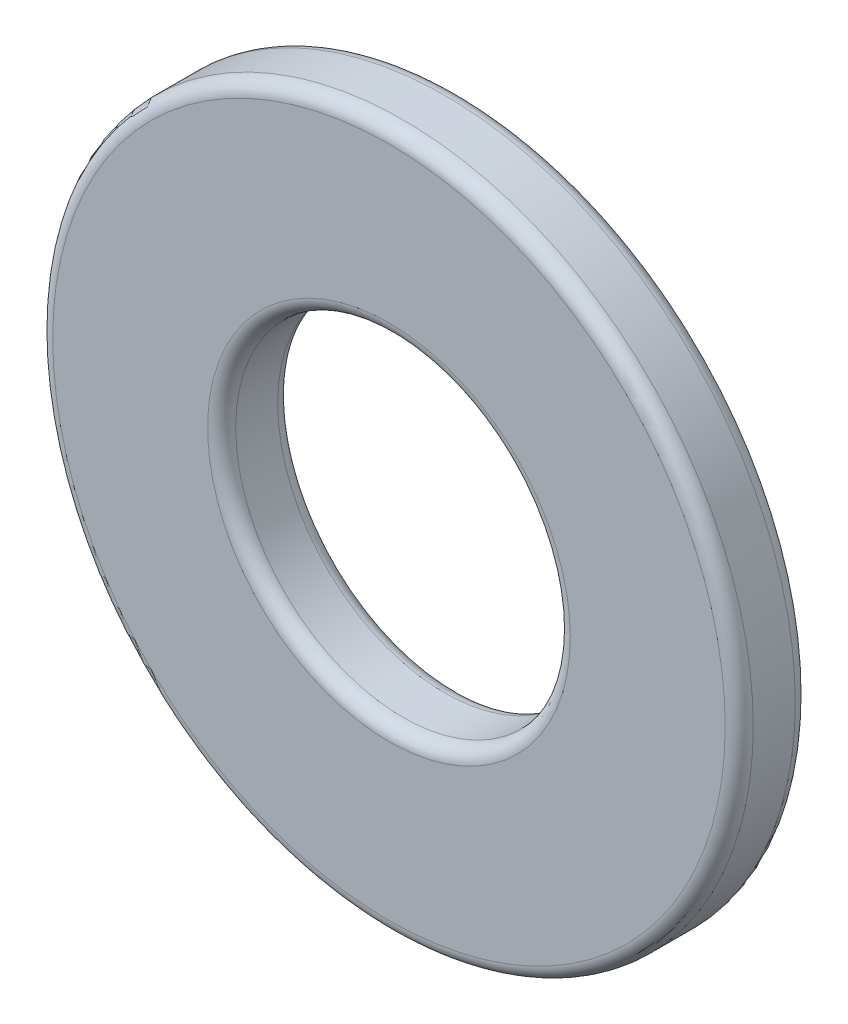
ISO-10303-21;
HEADER;
FILE_DESCRIPTION(('STEP AP214'),'2;1');
FILE_NAME('part.step','',(''),(''),'','','');
FILE_SCHEMA(('AUTOMOTIVE_DESIGN { 1 0 10303 214 1 1 1 1 }'));
ENDSEC;
DATA;
#1=APPLICATION_CONTEXT('core data for automotive mechanical design processes');
#2=APPLICATION_PROTOCOL_DEFINITION('international standard','automotive_design',2000,#1);
#3=PRODUCT_CONTEXT('',#1,'mechanical');
#4=PRODUCT('Part','Part','',(#3));
#5=PRODUCT_RELATED_PRODUCT_CATEGORY('part','',(#4));
#6=PRODUCT_DEFINITION_FORMATION('','',#4);
#7=PRODUCT_DEFINITION_CONTEXT('part definition',#1,'design');
#8=PRODUCT_DEFINITION('design','',#6,#7);
#9=PRODUCT_DEFINITION_SHAPE('','',#8);
#10=(LENGTH_UNIT() NAMED_UNIT(*) SI_UNIT(.MILLI.,.METRE.));
#11=(NAMED_UNIT(*) PLANE_ANGLE_UNIT() SI_UNIT($,.RADIAN.));
#12=(NAMED_UNIT(*) SI_UNIT($,.STERADIAN.) SOLID_ANGLE_UNIT());
#13=UNCERTAINTY_MEASURE_WITH_UNIT(LENGTH_MEASURE(1.E-05),#10,'distance_accuracy_value','');
#14=(GEOMETRIC_REPRESENTATION_CONTEXT(3) GLOBAL_UNCERTAINTY_ASSIGNED_CONTEXT((#13)) GLOBAL_UNIT_ASSIGNED_CONTEXT((#10,
#11,#12)) REPRESENTATION_CONTEXT('',''));
#15=CARTESIAN_POINT('',(0.,0.,0.));
#16=DIRECTION('',(0.,0.,1.));
#17=DIRECTION('',(1.,0.,0.));
#18=AXIS2_PLACEMENT_3D('',#15,#16,#17);
#19=CARTESIAN_POINT('',(0.,0.,-0.45));
#20=DIRECTION('',(0.,0.,1.));
#21=DIRECTION('',(1.,0.,0.));
#22=AXIS2_PLACEMENT_3D('',#19,#20,#21);
#23=CYLINDRICAL_SURFACE('',#22,4.5);
#24=CARTESIAN_POINT('',(0.,0.,-0.27));
#25=DIRECTION('',(0.,0.,1.));
#26=DIRECTION('',(1.,0.,0.));
#27=AXIS2_PLACEMENT_3D('',#24,#25,#26);
#28=CIRCLE('',#27,4.5);
#29=CARTESIAN_POINT('',(4.5,0.,-0.27));
#30=VERTEX_POINT('',#29);
#31=EDGE_CURVE('E117',#30,#30,#28,.T.);
#32=ORIENTED_EDGE('',*,*,#31,.T.);
#33=EDGE_LOOP('',(#32));
#34=FACE_BOUND('',#33,.T.);
#35=CARTESIAN_POINT('',(0.,0.,0.27));
#36=DIRECTION('',(0.,0.,1.));
#37=DIRECTION('',(1.,0.,0.));
#38=AXIS2_PLACEMENT_3D('',#35,#36,#37);
#39=CIRCLE('',#38,4.5);
#40=CARTESIAN_POINT('',(4.5,0.,0.27));
#41=VERTEX_POINT('',#40);
#42=EDGE_CURVE('E121',#41,#41,#39,.F.);
#43=ORIENTED_EDGE('',*,*,#42,.T.);
#44=EDGE_LOOP('',(#43));
#45=FACE_BOUND('',#44,.T.);
#46=ADVANCED_FACE('F85',(#34,#45),#23,.T.);
#47=CARTESIAN_POINT('',(0.,0.,-0.45));
#48=DIRECTION('',(0.,0.,1.));
#49=DIRECTION('',(1.,0.,0.));
#50=AXIS2_PLACEMENT_3D('',#47,#48,#49);
#51=PLANE('',#50);
#52=CARTESIAN_POINT('',(0.,0.,-0.45));
#53=DIRECTION('',(0.,0.,1.));
#54=DIRECTION('',(1.,0.,0.));
#55=AXIS2_PLACEMENT_3D('',#52,#53,#54);
#56=CIRCLE('',#55,4.32);
#57=CARTESIAN_POINT('',(4.32,0.,-0.45));
#58=VERTEX_POINT('',#57);
#59=EDGE_CURVE('E109',#58,#58,#56,.F.);
#60=ORIENTED_EDGE('',*,*,#59,.T.);
#61=EDGE_LOOP('',(#60));
#62=FACE_BOUND('',#61,.T.);
#63=CARTESIAN_POINT('',(0.,0.,-0.45));
#64=DIRECTION('',(0.,0.,1.));
#65=DIRECTION('',(1.,0.,0.));
#66=AXIS2_PLACEMENT_3D('',#63,#64,#65);
#67=CIRCLE('',#66,2.33);
#68=CARTESIAN_POINT('',(2.33,0.,-0.45));
#69=VERTEX_POINT('',#68);
#70=EDGE_CURVE('E113',#69,#69,#67,.T.);
#71=ORIENTED_EDGE('',*,*,#70,.T.);
#72=EDGE_LOOP('',(#71));
#73=FACE_BOUND('',#72,.T.);
#74=ADVANCED_FACE('F136',(#62,#73),#51,.F.);
#75=CARTESIAN_POINT('',(0.,0.,-0.45));
#76=DIRECTION('',(0.,0.,1.));
#77=DIRECTION('',(1.,0.,0.));
#78=AXIS2_PLACEMENT_3D('',#75,#76,#77);
#79=CYLINDRICAL_SURFACE('',#78,2.15);
#80=CARTESIAN_POINT('',(0.,0.,-0.27));
#81=DIRECTION('',(0.,0.,1.));
#82=DIRECTION('',(1.,0.,0.));
#83=AXIS2_PLACEMENT_3D('',#80,#81,#82);
#84=CIRCLE('',#83,2.15);
#85=CARTESIAN_POINT('',(2.15,0.,-0.27));
#86=VERTEX_POINT('',#85);
#87=EDGE_CURVE('E98',#86,#86,#84,.F.);
#88=ORIENTED_EDGE('',*,*,#87,.T.);
#89=EDGE_LOOP('',(#88));
#90=FACE_BOUND('',#89,.T.);
#91=CARTESIAN_POINT('',(0.,0.,0.27));
#92=DIRECTION('',(0.,0.,1.));
#93=DIRECTION('',(1.,0.,0.));
#94=AXIS2_PLACEMENT_3D('',#91,#92,#93);
#95=CIRCLE('',#94,2.15);
#96=CARTESIAN_POINT('',(2.15,0.,0.27));
#97=VERTEX_POINT('',#96);
#98=EDGE_CURVE('E103',#97,#97,#95,.T.);
#99=ORIENTED_EDGE('',*,*,#98,.T.);
#100=EDGE_LOOP('',(#99));
#101=FACE_BOUND('',#100,.T.);
#102=ADVANCED_FACE('F142',(#90,#101),#79,.F.);
#103=CARTESIAN_POINT('',(0.,0.,0.45));
#104=DIRECTION('',(0.,0.,1.));
#105=DIRECTION('',(1.,0.,0.));
#106=AXIS2_PLACEMENT_3D('',#103,#104,#105);
#107=PLANE('',#106);
#108=CARTESIAN_POINT('',(0.,0.,0.45));
#109=DIRECTION('',(0.,0.,1.));
#110=DIRECTION('',(1.,0.,0.));
#111=AXIS2_PLACEMENT_3D('',#108,#109,#110);
#112=CIRCLE('',#111,2.33);
#113=CARTESIAN_POINT('',(2.33,0.,0.45));
#114=VERTEX_POINT('',#113);
#115=EDGE_CURVE('E11',#114,#114,#112,.F.);
#116=ORIENTED_EDGE('',*,*,#115,.T.);
#117=EDGE_LOOP('',(#116));
#118=FACE_BOUND('',#117,.T.);
#119=CARTESIAN_POINT('',(0.,0.,0.45));
#120=DIRECTION('',(0.,0.,1.));
#121=DIRECTION('',(1.,0.,0.));
#122=AXIS2_PLACEMENT_3D('',#119,#120,#121);
#123=CIRCLE('',#122,4.32);
#124=CARTESIAN_POINT('',(4.32,0.,0.45));
#125=VERTEX_POINT('',#124);
#126=EDGE_CURVE('E93',#125,#125,#123,.T.);
#127=ORIENTED_EDGE('',*,*,#126,.T.);
#128=EDGE_LOOP('',(#127));
#129=FACE_BOUND('',#128,.T.);
#130=ADVANCED_FACE('F150',(#118,#129),#107,.T.);
#131=CARTESIAN_POINT('',(0.,0.,-0.27));
#132=DIRECTION('',(0.,0.,1.));
#133=DIRECTION('',(1.,0.,0.));
#134=AXIS2_PLACEMENT_3D('',#131,#132,#133);
#135=TOROIDAL_SURFACE('',#134,4.32,0.18);
#136=ORIENTED_EDGE('',*,*,#59,.F.);
#137=EDGE_LOOP('',(#136));
#138=FACE_BOUND('',#137,.T.);
#139=ORIENTED_EDGE('',*,*,#31,.F.);
#140=EDGE_LOOP('',(#139));
#141=FACE_BOUND('',#140,.T.);
#142=ADVANCED_FACE('F147',(#138,#141),#135,.T.);
#143=CARTESIAN_POINT('',(0.,0.,-0.27));
#144=DIRECTION('',(0.,0.,1.));
#145=DIRECTION('',(1.,0.,0.));
#146=AXIS2_PLACEMENT_3D('',#143,#144,#145);
#147=TOROIDAL_SURFACE('',#146,2.33,0.18);
#148=ORIENTED_EDGE('',*,*,#87,.F.);
#149=EDGE_LOOP('',(#148));
#150=FACE_BOUND('',#149,.T.);
#151=ORIENTED_EDGE('',*,*,#70,.F.);
#152=EDGE_LOOP('',(#151));
#153=FACE_BOUND('',#152,.T.);
#154=ADVANCED_FACE('F133',(#150,#153),#147,.T.);
#155=CARTESIAN_POINT('',(0.,0.,0.27));
#156=DIRECTION('',(0.,0.,1.));
#157=DIRECTION('',(1.,0.,0.));
#158=AXIS2_PLACEMENT_3D('',#155,#156,#157);
#159=TOROIDAL_SURFACE('',#158,2.33,0.18);
#160=ORIENTED_EDGE('',*,*,#115,.F.);
#161=EDGE_LOOP('',(#160));
#162=FACE_BOUND('',#161,.T.);
#163=ORIENTED_EDGE('',*,*,#98,.F.);
#164=EDGE_LOOP('',(#163));
#165=FACE_BOUND('',#164,.T.);
#166=ADVANCED_FACE('F129',(#162,#165),#159,.T.);
#167=CARTESIAN_POINT('',(0.,0.,0.27));
#168=DIRECTION('',(0.,0.,1.));
#169=DIRECTION('',(1.,0.,0.));
#170=AXIS2_PLACEMENT_3D('',#167,#168,#169);
#171=TOROIDAL_SURFACE('',#170,4.32,0.18);
#172=ORIENTED_EDGE('',*,*,#42,.F.);
#173=EDGE_LOOP('',(#172));
#174=FACE_BOUND('',#173,.T.);
#175=ORIENTED_EDGE('',*,*,#126,.F.);
#176=EDGE_LOOP('',(#175));
#177=FACE_BOUND('',#176,.T.);
#178=ADVANCED_FACE('F87',(#174,#177),#171,.T.);
#179=CLOSED_SHELL('',(#46,#74,#102,#130,#142,#154,#166,#178));
#180=MANIFOLD_SOLID_BREP('B2',#179);
#181=ADVANCED_BREP_SHAPE_REPRESENTATION('',(#18,#180),#14);
#182=SHAPE_DEFINITION_REPRESENTATION(#9,#181);
ENDSEC;
END-ISO-10303-21;
